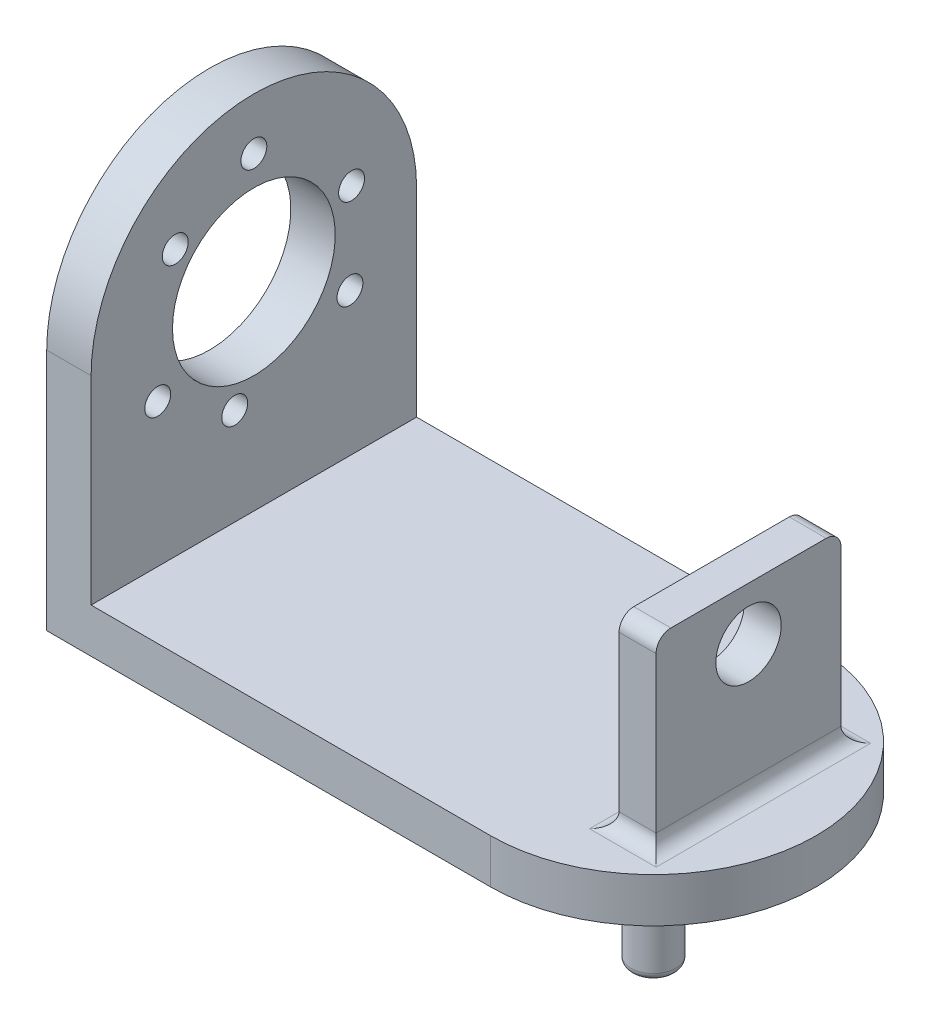
ISO-10303-21;
HEADER;
FILE_DESCRIPTION(('STEP AP214'),'2;1');
FILE_NAME('part.step','',(''),(''),'','','');
FILE_SCHEMA(('AUTOMOTIVE_DESIGN { 1 0 10303 214 1 1 1 1 }'));
ENDSEC;
DATA;
#1=APPLICATION_CONTEXT('core data for automotive mechanical design processes');
#2=APPLICATION_PROTOCOL_DEFINITION('international standard','automotive_design',2000,#1);
#3=PRODUCT_CONTEXT('',#1,'mechanical');
#4=PRODUCT('Part','Part','',(#3));
#5=PRODUCT_RELATED_PRODUCT_CATEGORY('part','',(#4));
#6=PRODUCT_DEFINITION_FORMATION('','',#4);
#7=PRODUCT_DEFINITION_CONTEXT('part definition',#1,'design');
#8=PRODUCT_DEFINITION('design','',#6,#7);
#9=PRODUCT_DEFINITION_SHAPE('','',#8);
#10=(LENGTH_UNIT() NAMED_UNIT(*) SI_UNIT(.MILLI.,.METRE.));
#11=(NAMED_UNIT(*) PLANE_ANGLE_UNIT() SI_UNIT($,.RADIAN.));
#12=(NAMED_UNIT(*) SI_UNIT($,.STERADIAN.) SOLID_ANGLE_UNIT());
#13=UNCERTAINTY_MEASURE_WITH_UNIT(LENGTH_MEASURE(1.E-05),#10,'distance_accuracy_value','');
#14=(GEOMETRIC_REPRESENTATION_CONTEXT(3) GLOBAL_UNCERTAINTY_ASSIGNED_CONTEXT((#13)) GLOBAL_UNIT_ASSIGNED_CONTEXT((#10,
#11,#12)) REPRESENTATION_CONTEXT('',''));
#15=CARTESIAN_POINT('',(0.,0.,0.));
#16=DIRECTION('',(0.,0.,1.));
#17=DIRECTION('',(1.,0.,0.));
#18=AXIS2_PLACEMENT_3D('',#15,#16,#17);
#19=CARTESIAN_POINT('',(0.,6.,0.));
#20=DIRECTION('',(0.,1.,0.));
#21=DIRECTION('',(0.,0.,1.));
#22=AXIS2_PLACEMENT_3D('',#19,#20,#21);
#23=PLANE('',#22);
#24=DIRECTION('',(0.,0.,-1.));
#25=VECTOR('',#24,1.);
#26=CARTESIAN_POINT('',(14.8645765224648,6.,0.));
#27=LINE('',#26,#25);
#28=CARTESIAN_POINT('',(14.8645765224648,6.,-14.5));
#29=VERTEX_POINT('',#28);
#30=CARTESIAN_POINT('',(14.8645765224648,6.,14.5));
#31=VERTEX_POINT('',#30);
#32=EDGE_CURVE('E237',#29,#31,#27,.F.);
#33=ORIENTED_EDGE('',*,*,#32,.T.);
#34=DIRECTION('',(1.,0.,0.));
#35=VECTOR('',#34,1.);
#36=CARTESIAN_POINT('',(0.,6.,14.5));
#37=LINE('',#36,#35);
#38=CARTESIAN_POINT('',(5.86457652246477,6.,14.5));
#39=VERTEX_POINT('',#38);
#40=EDGE_CURVE('E11',#31,#39,#37,.F.);
#41=ORIENTED_EDGE('',*,*,#40,.T.);
#42=DIRECTION('',(0.,0.,1.));
#43=VECTOR('',#42,1.);
#44=CARTESIAN_POINT('',(5.86457652246477,6.,0.));
#45=LINE('',#44,#43);
#46=CARTESIAN_POINT('',(5.86457652246477,6.,-14.5));
#47=VERTEX_POINT('',#46);
#48=EDGE_CURVE('E43',#39,#47,#45,.F.);
#49=ORIENTED_EDGE('',*,*,#48,.T.);
#50=DIRECTION('',(-1.,0.,0.));
#51=VECTOR('',#50,1.);
#52=CARTESIAN_POINT('',(0.,6.,-14.5));
#53=LINE('',#52,#51);
#54=EDGE_CURVE('E239',#47,#29,#53,.F.);
#55=ORIENTED_EDGE('',*,*,#54,.T.);
#56=EDGE_LOOP('',(#33,#41,#49,#55));
#57=FACE_BOUND('',#56,.T.);
#58=DIRECTION('',(-1.,0.,0.));
#59=VECTOR('',#58,1.);
#60=CARTESIAN_POINT('',(0.,6.,-22.));
#61=LINE('',#60,#59);
#62=CARTESIAN_POINT('',(0.,6.,-22.));
#63=VERTEX_POINT('',#62);
#64=CARTESIAN_POINT('',(-54.,6.,-22.));
#65=VERTEX_POINT('',#64);
#66=EDGE_CURVE('E175',#63,#65,#61,.T.);
#67=ORIENTED_EDGE('',*,*,#66,.T.);
#68=DIRECTION('',(0.,0.,1.));
#69=VECTOR('',#68,1.);
#70=CARTESIAN_POINT('',(-54.,6.,-22.));
#71=LINE('',#70,#69);
#72=CARTESIAN_POINT('',(-54.,6.,22.));
#73=VERTEX_POINT('',#72);
#74=EDGE_CURVE('E162',#65,#73,#71,.T.);
#75=ORIENTED_EDGE('',*,*,#74,.T.);
#76=DIRECTION('',(1.,0.,0.));
#77=VECTOR('',#76,1.);
#78=CARTESIAN_POINT('',(0.,6.,22.));
#79=LINE('',#78,#77);
#80=CARTESIAN_POINT('',(0.,6.,22.));
#81=VERTEX_POINT('',#80);
#82=EDGE_CURVE('E161',#73,#81,#79,.T.);
#83=ORIENTED_EDGE('',*,*,#82,.T.);
#84=CARTESIAN_POINT('',(0.,6.,0.));
#85=DIRECTION('',(0.,1.,0.));
#86=DIRECTION('',(0.,0.,1.));
#87=AXIS2_PLACEMENT_3D('',#84,#85,#86);
#88=CIRCLE('',#87,22.);
#89=EDGE_CURVE('E172',#81,#63,#88,.T.);
#90=ORIENTED_EDGE('',*,*,#89,.T.);
#91=EDGE_LOOP('',(#67,#75,#83,#90));
#92=FACE_BOUND('',#91,.T.);
#93=ADVANCED_FACE('F34',(#57,#92),#23,.T.);
#94=CARTESIAN_POINT('',(0.,6.,0.));
#95=DIRECTION('',(0.,-1.,0.));
#96=DIRECTION('',(0.,0.,-1.));
#97=AXIS2_PLACEMENT_3D('',#94,#95,#96);
#98=CYLINDRICAL_SURFACE('',#97,22.);
#99=CARTESIAN_POINT('',(0.,0.,0.));
#100=DIRECTION('',(0.,1.,0.));
#101=DIRECTION('',(0.,0.,1.));
#102=AXIS2_PLACEMENT_3D('',#99,#100,#101);
#103=CIRCLE('',#102,22.);
#104=CARTESIAN_POINT('',(0.,0.,22.));
#105=VERTEX_POINT('',#104);
#106=CARTESIAN_POINT('',(0.,0.,-22.));
#107=VERTEX_POINT('',#106);
#108=EDGE_CURVE('E170',#105,#107,#103,.T.);
#109=ORIENTED_EDGE('',*,*,#108,.T.);
#110=DIRECTION('',(0.,-1.,0.));
#111=VECTOR('',#110,1.);
#112=CARTESIAN_POINT('',(0.,6.,-22.));
#113=LINE('',#112,#111);
#114=EDGE_CURVE('E195',#63,#107,#113,.T.);
#115=ORIENTED_EDGE('',*,*,#114,.F.);
#116=ORIENTED_EDGE('',*,*,#89,.F.);
#117=DIRECTION('',(0.,-1.,0.));
#118=VECTOR('',#117,1.);
#119=CARTESIAN_POINT('',(0.,6.,22.));
#120=LINE('',#119,#118);
#121=EDGE_CURVE('E180',#81,#105,#120,.T.);
#122=ORIENTED_EDGE('',*,*,#121,.T.);
#123=EDGE_LOOP('',(#109,#115,#116,#122));
#124=FACE_BOUND('',#123,.T.);
#125=ADVANCED_FACE('F337',(#124),#98,.T.);
#126=CARTESIAN_POINT('',(0.,6.,-22.));
#127=DIRECTION('',(0.,0.,1.));
#128=DIRECTION('',(1.,0.,0.));
#129=AXIS2_PLACEMENT_3D('',#126,#127,#128);
#130=PLANE('',#129);
#131=DIRECTION('',(-1.,0.,0.));
#132=VECTOR('',#131,1.);
#133=CARTESIAN_POINT('',(0.,0.,-22.));
#134=LINE('',#133,#132);
#135=CARTESIAN_POINT('',(-60.,0.,-22.));
#136=VERTEX_POINT('',#135);
#137=EDGE_CURVE('E183',#107,#136,#134,.T.);
#138=ORIENTED_EDGE('',*,*,#137,.T.);
#139=DIRECTION('',(0.,-1.,0.));
#140=VECTOR('',#139,1.);
#141=CARTESIAN_POINT('',(-60.,6.,-22.));
#142=LINE('',#141,#140);
#143=CARTESIAN_POINT('',(-60.,32.8472910976164,-21.9999999717665));
#144=VERTEX_POINT('',#143);
#145=EDGE_CURVE('E192',#144,#136,#142,.T.);
#146=ORIENTED_EDGE('',*,*,#145,.F.);
#147=DIRECTION('',(-1.,0.,0.));
#148=VECTOR('',#147,1.);
#149=CARTESIAN_POINT('',(-54.,32.8472910976164,-21.9999999717665));
#150=LINE('',#149,#148);
#151=CARTESIAN_POINT('',(-54.,32.8472910976164,-21.9999999717665));
#152=VERTEX_POINT('',#151);
#153=EDGE_CURVE('E149',#152,#144,#150,.T.);
#154=ORIENTED_EDGE('',*,*,#153,.F.);
#155=DIRECTION('',(0.,-1.,-1.05163267165976E-09));
#156=VECTOR('',#155,1.);
#157=CARTESIAN_POINT('',(-54.,6.,-22.));
#158=LINE('',#157,#156);
#159=EDGE_CURVE('E150',#152,#65,#158,.T.);
#160=ORIENTED_EDGE('',*,*,#159,.T.);
#161=ORIENTED_EDGE('',*,*,#66,.F.);
#162=ORIENTED_EDGE('',*,*,#114,.T.);
#163=EDGE_LOOP('',(#138,#146,#154,#160,#161,#162));
#164=FACE_BOUND('',#163,.T.);
#165=ADVANCED_FACE('F327',(#164),#130,.F.);
#166=CARTESIAN_POINT('',(-60.,6.,-22.));
#167=DIRECTION('',(1.,0.,0.));
#168=DIRECTION('',(0.,0.,-1.));
#169=AXIS2_PLACEMENT_3D('',#166,#167,#168);
#170=PLANE('',#169);
#171=CARTESIAN_POINT('',(-60.,47.8484056706303,0.));
#172=DIRECTION('',(-1.,0.,0.));
#173=DIRECTION('',(0.,0.,1.));
#174=AXIS2_PLACEMENT_3D('',#171,#172,#173);
#175=CIRCLE('',#174,1.75);
#176=CARTESIAN_POINT('',(-60.,47.8484056706303,1.75000000000001));
#177=VERTEX_POINT('',#176);
#178=EDGE_CURVE('E298',#177,#177,#175,.T.);
#179=ORIENTED_EDGE('',*,*,#178,.F.);
#180=EDGE_LOOP('',(#179));
#181=FACE_BOUND('',#180,.T.);
#182=CARTESIAN_POINT('',(-60.,41.9663034576651,10.6237441584964));
#183=DIRECTION('',(-1.,0.,0.));
#184=DIRECTION('',(0.,0.,1.));
#185=AXIS2_PLACEMENT_3D('',#182,#183,#184);
#186=CIRCLE('',#185,1.75);
#187=CARTESIAN_POINT('',(-60.,41.9663034576651,12.3737441584964));
#188=VERTEX_POINT('',#187);
#189=EDGE_CURVE('E304',#188,#188,#186,.T.);
#190=ORIENTED_EDGE('',*,*,#189,.F.);
#191=EDGE_LOOP('',(#190));
#192=FACE_BOUND('',#191,.T.);
#193=CARTESIAN_POINT('',(-60.,25.3484056706306,12.9903810567672));
#194=DIRECTION('',(-1.,0.,0.));
#195=DIRECTION('',(0.,0.,1.));
#196=AXIS2_PLACEMENT_3D('',#193,#194,#195);
#197=CIRCLE('',#196,1.75);
#198=CARTESIAN_POINT('',(-60.,25.3484056706306,14.7403810567672));
#199=VERTEX_POINT('',#198);
#200=EDGE_CURVE('E310',#199,#199,#197,.T.);
#201=ORIENTED_EDGE('',*,*,#200,.F.);
#202=EDGE_LOOP('',(#201));
#203=FACE_BOUND('',#202,.T.);
#204=CARTESIAN_POINT('',(-60.,25.3484056706301,-12.990381056766));
#205=DIRECTION('',(-1.,0.,0.));
#206=DIRECTION('',(0.,0.,1.));
#207=AXIS2_PLACEMENT_3D('',#204,#205,#206);
#208=CIRCLE('',#207,1.75);
#209=CARTESIAN_POINT('',(-60.,25.3484056706301,-11.240381056766));
#210=VERTEX_POINT('',#209);
#211=EDGE_CURVE('E285',#210,#210,#208,.T.);
#212=ORIENTED_EDGE('',*,*,#211,.F.);
#213=EDGE_LOOP('',(#212));
#214=FACE_BOUND('',#213,.T.);
#215=CARTESIAN_POINT('',(-60.,19.0890244525483,2.58445903343442));
#216=DIRECTION('',(-1.,0.,0.));
#217=DIRECTION('',(0.,0.,1.));
#218=AXIS2_PLACEMENT_3D('',#215,#216,#217);
#219=CIRCLE('',#218,1.75);
#220=CARTESIAN_POINT('',(-60.,19.0890244525483,4.33445903343442));
#221=VERTEX_POINT('',#220);
#222=EDGE_CURVE('E286',#221,#221,#219,.T.);
#223=ORIENTED_EDGE('',*,*,#222,.F.);
#224=EDGE_LOOP('',(#223));
#225=FACE_BOUND('',#224,.T.);
#226=CARTESIAN_POINT('',(-60.,37.4898891016768,-13.2082031919301));
#227=DIRECTION('',(-1.,0.,0.));
#228=DIRECTION('',(0.,0.,1.));
#229=AXIS2_PLACEMENT_3D('',#226,#227,#228);
#230=CIRCLE('',#229,1.75000000000001);
#231=CARTESIAN_POINT('',(-60.,37.4898891016768,-11.45820319193));
#232=VERTEX_POINT('',#231);
#233=EDGE_CURVE('E281',#232,#232,#230,.T.);
#234=ORIENTED_EDGE('',*,*,#233,.F.);
#235=EDGE_LOOP('',(#234));
#236=FACE_BOUND('',#235,.T.);
#237=CARTESIAN_POINT('',(-60.,32.8484056706303,0.));
#238=DIRECTION('',(-1.,0.,0.));
#239=DIRECTION('',(0.,0.,1.));
#240=AXIS2_PLACEMENT_3D('',#237,#238,#239);
#241=CIRCLE('',#240,11.);
#242=CARTESIAN_POINT('',(-60.,32.8484056706303,11.));
#243=VERTEX_POINT('',#242);
#244=EDGE_CURVE('E297',#243,#243,#241,.T.);
#245=ORIENTED_EDGE('',*,*,#244,.F.);
#246=EDGE_LOOP('',(#245));
#247=FACE_BOUND('',#246,.T.);
#248=DIRECTION('',(0.,0.,1.));
#249=VECTOR('',#248,1.);
#250=CARTESIAN_POINT('',(-60.,0.,-22.));
#251=LINE('',#250,#249);
#252=CARTESIAN_POINT('',(-60.,0.,22.));
#253=VERTEX_POINT('',#252);
#254=EDGE_CURVE('E185',#136,#253,#251,.T.);
#255=ORIENTED_EDGE('',*,*,#254,.T.);
#256=DIRECTION('',(0.,-1.,0.));
#257=VECTOR('',#256,1.);
#258=CARTESIAN_POINT('',(-60.,6.,22.));
#259=LINE('',#258,#257);
#260=CARTESIAN_POINT('',(-60.,32.8484056706345,22.));
#261=VERTEX_POINT('',#260);
#262=EDGE_CURVE('E190',#261,#253,#259,.T.);
#263=ORIENTED_EDGE('',*,*,#262,.F.);
#264=CARTESIAN_POINT('',(-60.,32.8484056706303,0.));
#265=DIRECTION('',(-1.,0.,0.));
#266=DIRECTION('',(0.,0.,1.));
#267=AXIS2_PLACEMENT_3D('',#264,#265,#266);
#268=CIRCLE('',#267,22.);
#269=EDGE_CURVE('E145',#261,#144,#268,.T.);
#270=ORIENTED_EDGE('',*,*,#269,.T.);
#271=ORIENTED_EDGE('',*,*,#145,.T.);
#272=EDGE_LOOP('',(#255,#263,#270,#271));
#273=FACE_BOUND('',#272,.T.);
#274=ADVANCED_FACE('F324',(#181,#192,#203,#214,#225,#236,#247,#273),#170,.F.);
#275=CARTESIAN_POINT('',(0.,6.,22.));
#276=DIRECTION('',(0.,0.,-1.));
#277=DIRECTION('',(-1.,0.,0.));
#278=AXIS2_PLACEMENT_3D('',#275,#276,#277);
#279=PLANE('',#278);
#280=DIRECTION('',(1.,0.,0.));
#281=VECTOR('',#280,1.);
#282=CARTESIAN_POINT('',(0.,0.,22.));
#283=LINE('',#282,#281);
#284=EDGE_CURVE('E176',#253,#105,#283,.T.);
#285=ORIENTED_EDGE('',*,*,#284,.T.);
#286=ORIENTED_EDGE('',*,*,#121,.F.);
#287=ORIENTED_EDGE('',*,*,#82,.F.);
#288=DIRECTION('',(0.,1.,0.));
#289=VECTOR('',#288,1.);
#290=CARTESIAN_POINT('',(-54.,6.,22.));
#291=LINE('',#290,#289);
#292=CARTESIAN_POINT('',(-54.,32.8484056706345,22.));
#293=VERTEX_POINT('',#292);
#294=EDGE_CURVE('E154',#73,#293,#291,.T.);
#295=ORIENTED_EDGE('',*,*,#294,.T.);
#296=DIRECTION('',(-1.,0.,0.));
#297=VECTOR('',#296,1.);
#298=CARTESIAN_POINT('',(-54.,32.8484056706345,22.));
#299=LINE('',#298,#297);
#300=EDGE_CURVE('E138',#293,#261,#299,.T.);
#301=ORIENTED_EDGE('',*,*,#300,.T.);
#302=ORIENTED_EDGE('',*,*,#262,.T.);
#303=EDGE_LOOP('',(#285,#286,#287,#295,#301,#302));
#304=FACE_BOUND('',#303,.T.);
#305=ADVANCED_FACE('F159',(#304),#279,.F.);
#306=CARTESIAN_POINT('',(0.,0.,0.));
#307=DIRECTION('',(0.,1.,0.));
#308=DIRECTION('',(0.,0.,1.));
#309=AXIS2_PLACEMENT_3D('',#306,#307,#308);
#310=PLANE('',#309);
#311=CARTESIAN_POINT('',(0.,0.,0.));
#312=DIRECTION('',(0.,1.,0.));
#313=DIRECTION('',(0.,0.,1.));
#314=AXIS2_PLACEMENT_3D('',#311,#312,#313);
#315=CIRCLE('',#314,13.025);
#316=CARTESIAN_POINT('',(0.,0.,13.025));
#317=VERTEX_POINT('',#316);
#318=EDGE_CURVE('E201',#317,#317,#315,.T.);
#319=ORIENTED_EDGE('',*,*,#318,.T.);
#320=EDGE_LOOP('',(#319));
#321=FACE_BOUND('',#320,.T.);
#322=ORIENTED_EDGE('',*,*,#108,.F.);
#323=ORIENTED_EDGE('',*,*,#284,.F.);
#324=ORIENTED_EDGE('',*,*,#254,.F.);
#325=ORIENTED_EDGE('',*,*,#137,.F.);
#326=EDGE_LOOP('',(#322,#323,#324,#325));
#327=FACE_BOUND('',#326,.T.);
#328=ADVANCED_FACE('F334',(#321,#327),#310,.F.);
#329=CARTESIAN_POINT('',(-54.,32.8484056706303,0.));
#330=DIRECTION('',(-1.,0.,0.));
#331=DIRECTION('',(0.,0.,1.));
#332=AXIS2_PLACEMENT_3D('',#329,#330,#331);
#333=CYLINDRICAL_SURFACE('',#332,22.);
#334=ORIENTED_EDGE('',*,*,#269,.F.);
#335=ORIENTED_EDGE('',*,*,#300,.F.);
#336=CARTESIAN_POINT('',(-54.,32.8484056706303,0.));
#337=DIRECTION('',(-1.,0.,0.));
#338=DIRECTION('',(0.,0.,1.));
#339=AXIS2_PLACEMENT_3D('',#336,#337,#338);
#340=CIRCLE('',#339,22.);
#341=EDGE_CURVE('E142',#293,#152,#340,.T.);
#342=ORIENTED_EDGE('',*,*,#341,.T.);
#343=ORIENTED_EDGE('',*,*,#153,.T.);
#344=EDGE_LOOP('',(#334,#335,#342,#343));
#345=FACE_BOUND('',#344,.T.);
#346=ADVANCED_FACE('F140',(#345),#333,.T.);
#347=CARTESIAN_POINT('',(-54.,32.8484056706303,0.));
#348=DIRECTION('',(-1.,0.,0.));
#349=DIRECTION('',(0.,0.,1.));
#350=AXIS2_PLACEMENT_3D('',#347,#348,#349);
#351=PLANE('',#350);
#352=CARTESIAN_POINT('',(-54.,47.8484056706303,0.));
#353=DIRECTION('',(-1.,0.,0.));
#354=DIRECTION('',(0.,0.,1.));
#355=AXIS2_PLACEMENT_3D('',#352,#353,#354);
#356=CIRCLE('',#355,1.75);
#357=CARTESIAN_POINT('',(-54.,47.8484056706303,1.75000000000001));
#358=VERTEX_POINT('',#357);
#359=EDGE_CURVE('E294',#358,#358,#356,.T.);
#360=ORIENTED_EDGE('',*,*,#359,.T.);
#361=EDGE_LOOP('',(#360));
#362=FACE_BOUND('',#361,.T.);
#363=CARTESIAN_POINT('',(-54.,41.9663034576651,10.6237441584964));
#364=DIRECTION('',(-1.,0.,0.));
#365=DIRECTION('',(0.,0.,1.));
#366=AXIS2_PLACEMENT_3D('',#363,#364,#365);
#367=CIRCLE('',#366,1.75);
#368=CARTESIAN_POINT('',(-54.,41.9663034576651,12.3737441584964));
#369=VERTEX_POINT('',#368);
#370=EDGE_CURVE('E301',#369,#369,#367,.T.);
#371=ORIENTED_EDGE('',*,*,#370,.T.);
#372=EDGE_LOOP('',(#371));
#373=FACE_BOUND('',#372,.T.);
#374=CARTESIAN_POINT('',(-54.,25.3484056706306,12.9903810567672));
#375=DIRECTION('',(-1.,0.,0.));
#376=DIRECTION('',(0.,0.,1.));
#377=AXIS2_PLACEMENT_3D('',#374,#375,#376);
#378=CIRCLE('',#377,1.75);
#379=CARTESIAN_POINT('',(-54.,25.3484056706306,14.7403810567672));
#380=VERTEX_POINT('',#379);
#381=EDGE_CURVE('E307',#380,#380,#378,.T.);
#382=ORIENTED_EDGE('',*,*,#381,.T.);
#383=EDGE_LOOP('',(#382));
#384=FACE_BOUND('',#383,.T.);
#385=CARTESIAN_POINT('',(-54.,25.3484056706301,-12.990381056766));
#386=DIRECTION('',(-1.,0.,0.));
#387=DIRECTION('',(0.,0.,1.));
#388=AXIS2_PLACEMENT_3D('',#385,#386,#387);
#389=CIRCLE('',#388,1.75);
#390=CARTESIAN_POINT('',(-54.,25.3484056706301,-11.240381056766));
#391=VERTEX_POINT('',#390);
#392=EDGE_CURVE('E313',#391,#391,#389,.T.);
#393=ORIENTED_EDGE('',*,*,#392,.T.);
#394=EDGE_LOOP('',(#393));
#395=FACE_BOUND('',#394,.T.);
#396=CARTESIAN_POINT('',(-54.,19.0890244525483,2.58445903343442));
#397=DIRECTION('',(-1.,0.,0.));
#398=DIRECTION('',(0.,0.,1.));
#399=AXIS2_PLACEMENT_3D('',#396,#397,#398);
#400=CIRCLE('',#399,1.75);
#401=CARTESIAN_POINT('',(-54.,19.0890244525483,4.33445903343442));
#402=VERTEX_POINT('',#401);
#403=EDGE_CURVE('E282',#402,#402,#400,.T.);
#404=ORIENTED_EDGE('',*,*,#403,.T.);
#405=EDGE_LOOP('',(#404));
#406=FACE_BOUND('',#405,.T.);
#407=CARTESIAN_POINT('',(-54.,37.4898891016768,-13.2082031919301));
#408=DIRECTION('',(-1.,0.,0.));
#409=DIRECTION('',(0.,0.,1.));
#410=AXIS2_PLACEMENT_3D('',#407,#408,#409);
#411=CIRCLE('',#410,1.75000000000001);
#412=CARTESIAN_POINT('',(-54.,37.4898891016768,-11.45820319193));
#413=VERTEX_POINT('',#412);
#414=EDGE_CURVE('E289',#413,#413,#411,.T.);
#415=ORIENTED_EDGE('',*,*,#414,.T.);
#416=EDGE_LOOP('',(#415));
#417=FACE_BOUND('',#416,.T.);
#418=CARTESIAN_POINT('',(-54.,32.8484056706303,0.));
#419=DIRECTION('',(-1.,0.,0.));
#420=DIRECTION('',(0.,0.,1.));
#421=AXIS2_PLACEMENT_3D('',#418,#419,#420);
#422=CIRCLE('',#421,11.);
#423=CARTESIAN_POINT('',(-54.,32.8484056706303,11.));
#424=VERTEX_POINT('',#423);
#425=EDGE_CURVE('E169',#424,#424,#422,.T.);
#426=ORIENTED_EDGE('',*,*,#425,.T.);
#427=EDGE_LOOP('',(#426));
#428=FACE_BOUND('',#427,.T.);
#429=ORIENTED_EDGE('',*,*,#74,.F.);
#430=ORIENTED_EDGE('',*,*,#159,.F.);
#431=ORIENTED_EDGE('',*,*,#341,.F.);
#432=ORIENTED_EDGE('',*,*,#294,.F.);
#433=EDGE_LOOP('',(#429,#430,#431,#432));
#434=FACE_BOUND('',#433,.T.);
#435=ADVANCED_FACE('F153',(#362,#373,#384,#395,#406,#417,#428,#434),#351,.F.);
#436=CARTESIAN_POINT('',(-54.,32.8484056706303,0.));
#437=DIRECTION('',(-1.,0.,0.));
#438=DIRECTION('',(0.,0.,1.));
#439=AXIS2_PLACEMENT_3D('',#436,#437,#438);
#440=CYLINDRICAL_SURFACE('',#439,11.);
#441=ORIENTED_EDGE('',*,*,#425,.F.);
#442=EDGE_LOOP('',(#441));
#443=FACE_BOUND('',#442,.T.);
#444=ORIENTED_EDGE('',*,*,#244,.T.);
#445=EDGE_LOOP('',(#444));
#446=FACE_BOUND('',#445,.T.);
#447=ADVANCED_FACE('F322',(#443,#446),#440,.F.);
#448=CARTESIAN_POINT('',(-54.,37.4898891016768,-13.2082031919301));
#449=DIRECTION('',(-1.,0.,0.));
#450=DIRECTION('',(0.,0.,1.));
#451=AXIS2_PLACEMENT_3D('',#448,#449,#450);
#452=CYLINDRICAL_SURFACE('',#451,1.75000000000001);
#453=ORIENTED_EDGE('',*,*,#414,.F.);
#454=EDGE_LOOP('',(#453));
#455=FACE_BOUND('',#454,.T.);
#456=ORIENTED_EDGE('',*,*,#233,.T.);
#457=EDGE_LOOP('',(#456));
#458=FACE_BOUND('',#457,.T.);
#459=ADVANCED_FACE('F385',(#455,#458),#452,.F.);
#460=CARTESIAN_POINT('',(-54.,19.0890244525483,2.58445903343442));
#461=DIRECTION('',(-1.,0.,0.));
#462=DIRECTION('',(0.,0.,1.));
#463=AXIS2_PLACEMENT_3D('',#460,#461,#462);
#464=CYLINDRICAL_SURFACE('',#463,1.75);
#465=ORIENTED_EDGE('',*,*,#403,.F.);
#466=EDGE_LOOP('',(#465));
#467=FACE_BOUND('',#466,.T.);
#468=ORIENTED_EDGE('',*,*,#222,.T.);
#469=EDGE_LOOP('',(#468));
#470=FACE_BOUND('',#469,.T.);
#471=ADVANCED_FACE('F393',(#467,#470),#464,.F.);
#472=CARTESIAN_POINT('',(-54.,25.3484056706301,-12.990381056766));
#473=DIRECTION('',(-1.,0.,0.));
#474=DIRECTION('',(0.,0.,1.));
#475=AXIS2_PLACEMENT_3D('',#472,#473,#474);
#476=CYLINDRICAL_SURFACE('',#475,1.75);
#477=ORIENTED_EDGE('',*,*,#392,.F.);
#478=EDGE_LOOP('',(#477));
#479=FACE_BOUND('',#478,.T.);
#480=ORIENTED_EDGE('',*,*,#211,.T.);
#481=EDGE_LOOP('',(#480));
#482=FACE_BOUND('',#481,.T.);
#483=ADVANCED_FACE('F401',(#479,#482),#476,.F.);
#484=CARTESIAN_POINT('',(-54.,25.3484056706306,12.9903810567672));
#485=DIRECTION('',(-1.,0.,0.));
#486=DIRECTION('',(0.,0.,1.));
#487=AXIS2_PLACEMENT_3D('',#484,#485,#486);
#488=CYLINDRICAL_SURFACE('',#487,1.75);
#489=ORIENTED_EDGE('',*,*,#381,.F.);
#490=EDGE_LOOP('',(#489));
#491=FACE_BOUND('',#490,.T.);
#492=ORIENTED_EDGE('',*,*,#200,.T.);
#493=EDGE_LOOP('',(#492));
#494=FACE_BOUND('',#493,.T.);
#495=ADVANCED_FACE('F409',(#491,#494),#488,.F.);
#496=CARTESIAN_POINT('',(-54.,41.9663034576651,10.6237441584964));
#497=DIRECTION('',(-1.,0.,0.));
#498=DIRECTION('',(0.,0.,1.));
#499=AXIS2_PLACEMENT_3D('',#496,#497,#498);
#500=CYLINDRICAL_SURFACE('',#499,1.75);
#501=ORIENTED_EDGE('',*,*,#370,.F.);
#502=EDGE_LOOP('',(#501));
#503=FACE_BOUND('',#502,.T.);
#504=ORIENTED_EDGE('',*,*,#189,.T.);
#505=EDGE_LOOP('',(#504));
#506=FACE_BOUND('',#505,.T.);
#507=ADVANCED_FACE('F417',(#503,#506),#500,.F.);
#508=CARTESIAN_POINT('',(-54.,47.8484056706303,0.));
#509=DIRECTION('',(-1.,0.,0.));
#510=DIRECTION('',(0.,0.,1.));
#511=AXIS2_PLACEMENT_3D('',#508,#509,#510);
#512=CYLINDRICAL_SURFACE('',#511,1.75);
#513=ORIENTED_EDGE('',*,*,#359,.F.);
#514=EDGE_LOOP('',(#513));
#515=FACE_BOUND('',#514,.T.);
#516=ORIENTED_EDGE('',*,*,#178,.T.);
#517=EDGE_LOOP('',(#516));
#518=FACE_BOUND('',#517,.T.);
#519=ADVANCED_FACE('F425',(#515,#518),#512,.F.);
#520=CARTESIAN_POINT('',(0.,-20.,0.));
#521=DIRECTION('',(0.,1.,0.));
#522=DIRECTION('',(0.,0.,1.));
#523=AXIS2_PLACEMENT_3D('',#520,#521,#522);
#524=CYLINDRICAL_SURFACE('',#523,3.025);
#525=CARTESIAN_POINT('',(0.,-19.,0.));
#526=DIRECTION('',(0.,-1.,0.));
#527=DIRECTION('',(0.,0.,-1.));
#528=AXIS2_PLACEMENT_3D('',#525,#526,#527);
#529=CIRCLE('',#528,3.025);
#530=CARTESIAN_POINT('',(0.,-19.,-3.025));
#531=VERTEX_POINT('',#530);
#532=EDGE_CURVE('E207',#531,#531,#529,.F.);
#533=ORIENTED_EDGE('',*,*,#532,.T.);
#534=EDGE_LOOP('',(#533));
#535=FACE_BOUND('',#534,.T.);
#536=CARTESIAN_POINT('',(0.,-10.,0.));
#537=DIRECTION('',(0.,1.,0.));
#538=DIRECTION('',(0.,0.,1.));
#539=AXIS2_PLACEMENT_3D('',#536,#537,#538);
#540=CIRCLE('',#539,3.025);
#541=CARTESIAN_POINT('',(0.,-10.,3.025));
#542=VERTEX_POINT('',#541);
#543=EDGE_CURVE('E198',#542,#542,#540,.F.);
#544=ORIENTED_EDGE('',*,*,#543,.T.);
#545=EDGE_LOOP('',(#544));
#546=FACE_BOUND('',#545,.T.);
#547=ADVANCED_FACE('F432',(#535,#546),#524,.T.);
#548=CARTESIAN_POINT('',(0.,-20.,0.));
#549=DIRECTION('',(0.,-1.,0.));
#550=DIRECTION('',(0.,0.,-1.));
#551=AXIS2_PLACEMENT_3D('',#548,#549,#550);
#552=PLANE('',#551);
#553=CARTESIAN_POINT('',(0.,-20.,0.));
#554=DIRECTION('',(0.,-1.,0.));
#555=DIRECTION('',(0.,0.,-1.));
#556=AXIS2_PLACEMENT_3D('',#553,#554,#555);
#557=CIRCLE('',#556,2.025);
#558=CARTESIAN_POINT('',(0.,-20.,-2.025));
#559=VERTEX_POINT('',#558);
#560=EDGE_CURVE('E204',#559,#559,#557,.T.);
#561=ORIENTED_EDGE('',*,*,#560,.T.);
#562=EDGE_LOOP('',(#561));
#563=FACE_BOUND('',#562,.T.);
#564=ADVANCED_FACE('F440',(#563),#552,.T.);
#565=CARTESIAN_POINT('',(0.,-10.,0.));
#566=DIRECTION('',(0.,1.,0.));
#567=DIRECTION('',(0.,0.,1.));
#568=AXIS2_PLACEMENT_3D('',#565,#566,#567);
#569=TOROIDAL_SURFACE('',#568,13.025,10.);
#570=ORIENTED_EDGE('',*,*,#318,.F.);
#571=EDGE_LOOP('',(#570));
#572=FACE_BOUND('',#571,.T.);
#573=ORIENTED_EDGE('',*,*,#543,.F.);
#574=EDGE_LOOP('',(#573));
#575=FACE_BOUND('',#574,.T.);
#576=ADVANCED_FACE('F448',(#572,#575),#569,.F.);
#577=CARTESIAN_POINT('',(0.,-19.,0.));
#578=DIRECTION('',(0.,-1.,0.));
#579=DIRECTION('',(0.,0.,-1.));
#580=AXIS2_PLACEMENT_3D('',#577,#578,#579);
#581=TOROIDAL_SURFACE('',#580,2.025,1.);
#582=ORIENTED_EDGE('',*,*,#532,.F.);
#583=EDGE_LOOP('',(#582));
#584=FACE_BOUND('',#583,.T.);
#585=ORIENTED_EDGE('',*,*,#560,.F.);
#586=EDGE_LOOP('',(#585));
#587=FACE_BOUND('',#586,.T.);
#588=ADVANCED_FACE('F456',(#584,#587),#581,.T.);
#589=CARTESIAN_POINT('',(12.8645765224648,31.,12.5));
#590=DIRECTION('',(-1.,0.,0.));
#591=DIRECTION('',(0.,0.,1.));
#592=AXIS2_PLACEMENT_3D('',#589,#590,#591);
#593=PLANE('',#592);
#594=CARTESIAN_POINT('',(12.8645765224648,23.8788105851321,0.));
#595=DIRECTION('',(1.,0.,0.));
#596=DIRECTION('',(0.,0.,-1.));
#597=AXIS2_PLACEMENT_3D('',#594,#595,#596);
#598=CIRCLE('',#597,4.41956701465138);
#599=CARTESIAN_POINT('',(12.8645765224648,23.8788105851321,-4.41956701465138));
#600=VERTEX_POINT('',#599);
#601=EDGE_CURVE('E251',#600,#600,#598,.T.);
#602=ORIENTED_EDGE('',*,*,#601,.F.);
#603=EDGE_LOOP('',(#602));
#604=FACE_BOUND('',#603,.T.);
#605=DIRECTION('',(0.,0.,-1.));
#606=VECTOR('',#605,1.);
#607=CARTESIAN_POINT('',(12.8645765224648,31.,12.5));
#608=LINE('',#607,#606);
#609=CARTESIAN_POINT('',(12.8645765224648,31.,10.5));
#610=VERTEX_POINT('',#609);
#611=CARTESIAN_POINT('',(12.8645765224648,31.,-10.5));
#612=VERTEX_POINT('',#611);
#613=EDGE_CURVE('E261',#610,#612,#608,.T.);
#614=ORIENTED_EDGE('',*,*,#613,.F.);
#615=CARTESIAN_POINT('',(12.8645765224648,29.,10.5));
#616=DIRECTION('',(-1.,0.,0.));
#617=DIRECTION('',(0.,0.,1.));
#618=AXIS2_PLACEMENT_3D('',#615,#616,#617);
#619=CIRCLE('',#618,2.);
#620=CARTESIAN_POINT('',(12.8645765224648,29.,12.5));
#621=VERTEX_POINT('',#620);
#622=EDGE_CURVE('E220',#610,#621,#619,.F.);
#623=ORIENTED_EDGE('',*,*,#622,.T.);
#624=DIRECTION('',(0.,-1.,0.));
#625=VECTOR('',#624,1.);
#626=CARTESIAN_POINT('',(12.8645765224648,31.,12.5));
#627=LINE('',#626,#625);
#628=CARTESIAN_POINT('',(12.8645765224648,8.,12.5));
#629=VERTEX_POINT('',#628);
#630=EDGE_CURVE('E269',#621,#629,#627,.T.);
#631=ORIENTED_EDGE('',*,*,#630,.T.);
#632=DIRECTION('',(0.,0.,-1.));
#633=VECTOR('',#632,1.);
#634=CARTESIAN_POINT('',(12.8645765224648,8.,12.5));
#635=LINE('',#634,#633);
#636=CARTESIAN_POINT('',(12.8645765224648,8.,-12.5));
#637=VERTEX_POINT('',#636);
#638=EDGE_CURVE('E216',#629,#637,#635,.T.);
#639=ORIENTED_EDGE('',*,*,#638,.T.);
#640=DIRECTION('',(0.,-1.,0.));
#641=VECTOR('',#640,1.);
#642=CARTESIAN_POINT('',(12.8645765224648,31.,-12.5));
#643=LINE('',#642,#641);
#644=CARTESIAN_POINT('',(12.8645765224648,29.,-12.5));
#645=VERTEX_POINT('',#644);
#646=EDGE_CURVE('E278',#645,#637,#643,.T.);
#647=ORIENTED_EDGE('',*,*,#646,.F.);
#648=CARTESIAN_POINT('',(12.8645765224648,29.,-10.5));
#649=DIRECTION('',(-1.,0.,0.));
#650=DIRECTION('',(0.,0.,1.));
#651=AXIS2_PLACEMENT_3D('',#648,#649,#650);
#652=CIRCLE('',#651,2.);
#653=EDGE_CURVE('E218',#645,#612,#652,.F.);
#654=ORIENTED_EDGE('',*,*,#653,.T.);
#655=EDGE_LOOP('',(#614,#623,#631,#639,#647,#654));
#656=FACE_BOUND('',#655,.T.);
#657=ADVANCED_FACE('F463',(#604,#656),#593,.F.);
#658=CARTESIAN_POINT('',(7.86457652246477,31.,-12.5));
#659=DIRECTION('',(0.,0.,1.));
#660=DIRECTION('',(1.,0.,0.));
#661=AXIS2_PLACEMENT_3D('',#658,#659,#660);
#662=PLANE('',#661);
#663=DIRECTION('',(0.,-1.,0.));
#664=VECTOR('',#663,1.);
#665=CARTESIAN_POINT('',(7.86457652246477,31.,-12.5));
#666=LINE('',#665,#664);
#667=CARTESIAN_POINT('',(7.86457652246477,29.,-12.5));
#668=VERTEX_POINT('',#667);
#669=CARTESIAN_POINT('',(7.86457652246477,8.,-12.5));
#670=VERTEX_POINT('',#669);
#671=EDGE_CURVE('E275',#668,#670,#666,.T.);
#672=ORIENTED_EDGE('',*,*,#671,.F.);
#673=DIRECTION('',(-1.,0.,0.));
#674=VECTOR('',#673,1.);
#675=CARTESIAN_POINT('',(7.86457652246477,29.,-12.5));
#676=LINE('',#675,#674);
#677=EDGE_CURVE('E235',#668,#645,#676,.F.);
#678=ORIENTED_EDGE('',*,*,#677,.T.);
#679=ORIENTED_EDGE('',*,*,#646,.T.);
#680=DIRECTION('',(-1.,0.,0.));
#681=VECTOR('',#680,1.);
#682=CARTESIAN_POINT('',(7.86457652246477,8.,-12.5));
#683=LINE('',#682,#681);
#684=EDGE_CURVE('E233',#637,#670,#683,.T.);
#685=ORIENTED_EDGE('',*,*,#684,.T.);
#686=EDGE_LOOP('',(#672,#678,#679,#685));
#687=FACE_BOUND('',#686,.T.);
#688=ADVANCED_FACE('F472',(#687),#662,.F.);
#689=CARTESIAN_POINT('',(7.86457652246477,31.,12.5));
#690=DIRECTION('',(1.,0.,0.));
#691=DIRECTION('',(0.,0.,-1.));
#692=AXIS2_PLACEMENT_3D('',#689,#690,#691);
#693=PLANE('',#692);
#694=CARTESIAN_POINT('',(7.86457652246476,23.8788105851321,0.));
#695=DIRECTION('',(1.,0.,0.));
#696=DIRECTION('',(0.,0.,-1.));
#697=AXIS2_PLACEMENT_3D('',#694,#695,#696);
#698=CIRCLE('',#697,4.41956701465138);
#699=CARTESIAN_POINT('',(7.86457652246476,23.8788105851321,-4.41956701465138));
#700=VERTEX_POINT('',#699);
#701=EDGE_CURVE('E256',#700,#700,#698,.F.);
#702=ORIENTED_EDGE('',*,*,#701,.F.);
#703=EDGE_LOOP('',(#702));
#704=FACE_BOUND('',#703,.T.);
#705=DIRECTION('',(0.,-1.,0.));
#706=VECTOR('',#705,1.);
#707=CARTESIAN_POINT('',(7.86457652246477,31.,12.5));
#708=LINE('',#707,#706);
#709=CARTESIAN_POINT('',(7.86457652246477,29.,12.5));
#710=VERTEX_POINT('',#709);
#711=CARTESIAN_POINT('',(7.86457652246477,8.,12.5));
#712=VERTEX_POINT('',#711);
#713=EDGE_CURVE('E272',#710,#712,#708,.T.);
#714=ORIENTED_EDGE('',*,*,#713,.F.);
#715=CARTESIAN_POINT('',(7.86457652246477,29.,10.5));
#716=DIRECTION('',(1.,0.,0.));
#717=DIRECTION('',(0.,0.,-1.));
#718=AXIS2_PLACEMENT_3D('',#715,#716,#717);
#719=CIRCLE('',#718,2.);
#720=CARTESIAN_POINT('',(7.86457652246477,31.,10.5));
#721=VERTEX_POINT('',#720);
#722=EDGE_CURVE('E231',#710,#721,#719,.F.);
#723=ORIENTED_EDGE('',*,*,#722,.T.);
#724=DIRECTION('',(0.,0.,1.));
#725=VECTOR('',#724,1.);
#726=CARTESIAN_POINT('',(7.86457652246477,31.,12.5));
#727=LINE('',#726,#725);
#728=CARTESIAN_POINT('',(7.86457652246477,31.,-10.5));
#729=VERTEX_POINT('',#728);
#730=EDGE_CURVE('E266',#729,#721,#727,.T.);
#731=ORIENTED_EDGE('',*,*,#730,.F.);
#732=CARTESIAN_POINT('',(7.86457652246477,29.,-10.5));
#733=DIRECTION('',(1.,0.,0.));
#734=DIRECTION('',(0.,0.,-1.));
#735=AXIS2_PLACEMENT_3D('',#732,#733,#734);
#736=CIRCLE('',#735,2.);
#737=EDGE_CURVE('E229',#729,#668,#736,.F.);
#738=ORIENTED_EDGE('',*,*,#737,.T.);
#739=ORIENTED_EDGE('',*,*,#671,.T.);
#740=DIRECTION('',(0.,0.,1.));
#741=VECTOR('',#740,1.);
#742=CARTESIAN_POINT('',(7.86457652246477,8.,12.5));
#743=LINE('',#742,#741);
#744=EDGE_CURVE('E227',#670,#712,#743,.T.);
#745=ORIENTED_EDGE('',*,*,#744,.T.);
#746=EDGE_LOOP('',(#714,#723,#731,#738,#739,#745));
#747=FACE_BOUND('',#746,.T.);
#748=ADVANCED_FACE('F480',(#704,#747),#693,.F.);
#749=CARTESIAN_POINT('',(7.86457652246477,31.,12.5));
#750=DIRECTION('',(0.,0.,-1.));
#751=DIRECTION('',(-1.,0.,0.));
#752=AXIS2_PLACEMENT_3D('',#749,#750,#751);
#753=PLANE('',#752);
#754=ORIENTED_EDGE('',*,*,#630,.F.);
#755=DIRECTION('',(1.,0.,0.));
#756=VECTOR('',#755,1.);
#757=CARTESIAN_POINT('',(7.86457652246477,29.,12.5));
#758=LINE('',#757,#756);
#759=EDGE_CURVE('E225',#621,#710,#758,.F.);
#760=ORIENTED_EDGE('',*,*,#759,.T.);
#761=ORIENTED_EDGE('',*,*,#713,.T.);
#762=DIRECTION('',(1.,0.,0.));
#763=VECTOR('',#762,1.);
#764=CARTESIAN_POINT('',(7.86457652246477,8.,12.5));
#765=LINE('',#764,#763);
#766=EDGE_CURVE('E222',#712,#629,#765,.T.);
#767=ORIENTED_EDGE('',*,*,#766,.T.);
#768=EDGE_LOOP('',(#754,#760,#761,#767));
#769=FACE_BOUND('',#768,.T.);
#770=ADVANCED_FACE('F488',(#769),#753,.F.);
#771=CARTESIAN_POINT('',(0.,31.,0.));
#772=DIRECTION('',(0.,-1.,0.));
#773=DIRECTION('',(0.,0.,-1.));
#774=AXIS2_PLACEMENT_3D('',#771,#772,#773);
#775=PLANE('',#774);
#776=ORIENTED_EDGE('',*,*,#730,.T.);
#777=DIRECTION('',(1.,0.,0.));
#778=VECTOR('',#777,1.);
#779=CARTESIAN_POINT('',(0.,31.,10.5));
#780=LINE('',#779,#778);
#781=EDGE_CURVE('E213',#721,#610,#780,.T.);
#782=ORIENTED_EDGE('',*,*,#781,.T.);
#783=ORIENTED_EDGE('',*,*,#613,.T.);
#784=DIRECTION('',(-1.,0.,0.));
#785=VECTOR('',#784,1.);
#786=CARTESIAN_POINT('',(0.,31.,-10.5));
#787=LINE('',#786,#785);
#788=EDGE_CURVE('E210',#612,#729,#787,.T.);
#789=ORIENTED_EDGE('',*,*,#788,.T.);
#790=EDGE_LOOP('',(#776,#782,#783,#789));
#791=FACE_BOUND('',#790,.T.);
#792=ADVANCED_FACE('F496',(#791),#775,.F.);
#793=CARTESIAN_POINT('',(-60.001,23.8788105851321,0.));
#794=DIRECTION('',(1.,0.,0.));
#795=DIRECTION('',(0.,0.,-1.));
#796=AXIS2_PLACEMENT_3D('',#793,#794,#795);
#797=CYLINDRICAL_SURFACE('',#796,4.41956701465138);
#798=ORIENTED_EDGE('',*,*,#601,.T.);
#799=EDGE_LOOP('',(#798));
#800=FACE_BOUND('',#799,.T.);
#801=ORIENTED_EDGE('',*,*,#701,.T.);
#802=EDGE_LOOP('',(#801));
#803=FACE_BOUND('',#802,.T.);
#804=ADVANCED_FACE('F504',(#800,#803),#797,.F.);
#805=CARTESIAN_POINT('',(0.,29.,10.5));
#806=DIRECTION('',(1.,0.,0.));
#807=DIRECTION('',(0.,0.,-1.));
#808=AXIS2_PLACEMENT_3D('',#805,#806,#807);
#809=CYLINDRICAL_SURFACE('',#808,2.);
#810=ORIENTED_EDGE('',*,*,#722,.F.);
#811=ORIENTED_EDGE('',*,*,#759,.F.);
#812=ORIENTED_EDGE('',*,*,#622,.F.);
#813=ORIENTED_EDGE('',*,*,#781,.F.);
#814=EDGE_LOOP('',(#810,#811,#812,#813));
#815=FACE_BOUND('',#814,.T.);
#816=ADVANCED_FACE('F512',(#815),#809,.T.);
#817=CARTESIAN_POINT('',(0.,29.,-10.5));
#818=DIRECTION('',(-1.,0.,0.));
#819=DIRECTION('',(0.,0.,1.));
#820=AXIS2_PLACEMENT_3D('',#817,#818,#819);
#821=CYLINDRICAL_SURFACE('',#820,2.);
#822=ORIENTED_EDGE('',*,*,#653,.F.);
#823=ORIENTED_EDGE('',*,*,#677,.F.);
#824=ORIENTED_EDGE('',*,*,#737,.F.);
#825=ORIENTED_EDGE('',*,*,#788,.F.);
#826=EDGE_LOOP('',(#822,#823,#824,#825));
#827=FACE_BOUND('',#826,.T.);
#828=ADVANCED_FACE('F518',(#827),#821,.T.);
#829=CARTESIAN_POINT('',(7.86457652246477,8.,-14.5));
#830=DIRECTION('',(-1.,0.,0.));
#831=DIRECTION('',(0.,0.,1.));
#832=AXIS2_PLACEMENT_3D('',#829,#830,#831);
#833=CYLINDRICAL_SURFACE('',#832,2.);
#834=CARTESIAN_POINT('',(14.8645765224648,8.,-14.5));
#835=DIRECTION('',(-0.707106781186547,0.,-0.707106781186547));
#836=DIRECTION('',(0.707106781186547,0.,-0.707106781186547));
#837=AXIS2_PLACEMENT_3D('',#834,#835,#836);
#838=ELLIPSE('',#837,2.82842712474619,2.);
#839=EDGE_CURVE('E244',#29,#637,#838,.T.);
#840=ORIENTED_EDGE('',*,*,#839,.F.);
#841=ORIENTED_EDGE('',*,*,#54,.F.);
#842=CARTESIAN_POINT('',(5.86457652246477,8.,-14.5));
#843=DIRECTION('',(-0.707106781186547,0.,0.707106781186547));
#844=DIRECTION('',(-0.707106781186547,0.,-0.707106781186547));
#845=AXIS2_PLACEMENT_3D('',#842,#843,#844);
#846=ELLIPSE('',#845,2.82842712474619,2.);
#847=EDGE_CURVE('E38',#670,#47,#846,.F.);
#848=ORIENTED_EDGE('',*,*,#847,.F.);
#849=ORIENTED_EDGE('',*,*,#684,.F.);
#850=EDGE_LOOP('',(#840,#841,#848,#849));
#851=FACE_BOUND('',#850,.T.);
#852=ADVANCED_FACE('F36',(#851),#833,.F.);
#853=CARTESIAN_POINT('',(5.86457652246477,8.,12.5));
#854=DIRECTION('',(0.,0.,1.));
#855=DIRECTION('',(1.,0.,0.));
#856=AXIS2_PLACEMENT_3D('',#853,#854,#855);
#857=CYLINDRICAL_SURFACE('',#856,2.);
#858=ORIENTED_EDGE('',*,*,#847,.T.);
#859=ORIENTED_EDGE('',*,*,#48,.F.);
#860=CARTESIAN_POINT('',(5.86457652246477,8.,14.5));
#861=DIRECTION('',(0.707106781186547,0.,0.707106781186547));
#862=DIRECTION('',(-0.707106781186547,0.,0.707106781186547));
#863=AXIS2_PLACEMENT_3D('',#860,#861,#862);
#864=ELLIPSE('',#863,2.82842712474619,2.);
#865=EDGE_CURVE('E51',#712,#39,#864,.F.);
#866=ORIENTED_EDGE('',*,*,#865,.F.);
#867=ORIENTED_EDGE('',*,*,#744,.F.);
#868=EDGE_LOOP('',(#858,#859,#866,#867));
#869=FACE_BOUND('',#868,.T.);
#870=ADVANCED_FACE('F533',(#869),#857,.F.);
#871=CARTESIAN_POINT('',(14.8645765224648,8.,12.5));
#872=DIRECTION('',(0.,0.,-1.));
#873=DIRECTION('',(-1.,0.,0.));
#874=AXIS2_PLACEMENT_3D('',#871,#872,#873);
#875=CYLINDRICAL_SURFACE('',#874,2.);
#876=ORIENTED_EDGE('',*,*,#839,.T.);
#877=ORIENTED_EDGE('',*,*,#638,.F.);
#878=CARTESIAN_POINT('',(14.8645765224648,8.,14.5));
#879=DIRECTION('',(0.707106781186547,0.,-0.707106781186547));
#880=DIRECTION('',(-0.707106781186547,0.,-0.707106781186547));
#881=AXIS2_PLACEMENT_3D('',#878,#879,#880);
#882=ELLIPSE('',#881,2.82842712474619,2.);
#883=EDGE_CURVE('E242',#31,#629,#882,.T.);
#884=ORIENTED_EDGE('',*,*,#883,.F.);
#885=ORIENTED_EDGE('',*,*,#32,.F.);
#886=EDGE_LOOP('',(#876,#877,#884,#885));
#887=FACE_BOUND('',#886,.T.);
#888=ADVANCED_FACE('F540',(#887),#875,.F.);
#889=CARTESIAN_POINT('',(7.86457652246477,8.,14.5));
#890=DIRECTION('',(1.,0.,0.));
#891=DIRECTION('',(0.,0.,-1.));
#892=AXIS2_PLACEMENT_3D('',#889,#890,#891);
#893=CYLINDRICAL_SURFACE('',#892,2.);
#894=ORIENTED_EDGE('',*,*,#865,.T.);
#895=ORIENTED_EDGE('',*,*,#40,.F.);
#896=ORIENTED_EDGE('',*,*,#883,.T.);
#897=ORIENTED_EDGE('',*,*,#766,.F.);
#898=EDGE_LOOP('',(#894,#895,#896,#897));
#899=FACE_BOUND('',#898,.T.);
#900=ADVANCED_FACE('F546',(#899),#893,.F.);
#901=CLOSED_SHELL('',(#93,#125,#165,#274,#305,#328,#346,#435,#447,#459,#471,#483,#495,#507,#519,
#547,#564,#576,#588,#657,#688,#748,#770,#792,#804,#816,#828,#852,#870,#888,#900));
#902=MANIFOLD_SOLID_BREP('B2',#901);
#903=ADVANCED_BREP_SHAPE_REPRESENTATION('',(#18,#902),#14);
#904=SHAPE_DEFINITION_REPRESENTATION(#9,#903);
ENDSEC;
END-ISO-10303-21;
